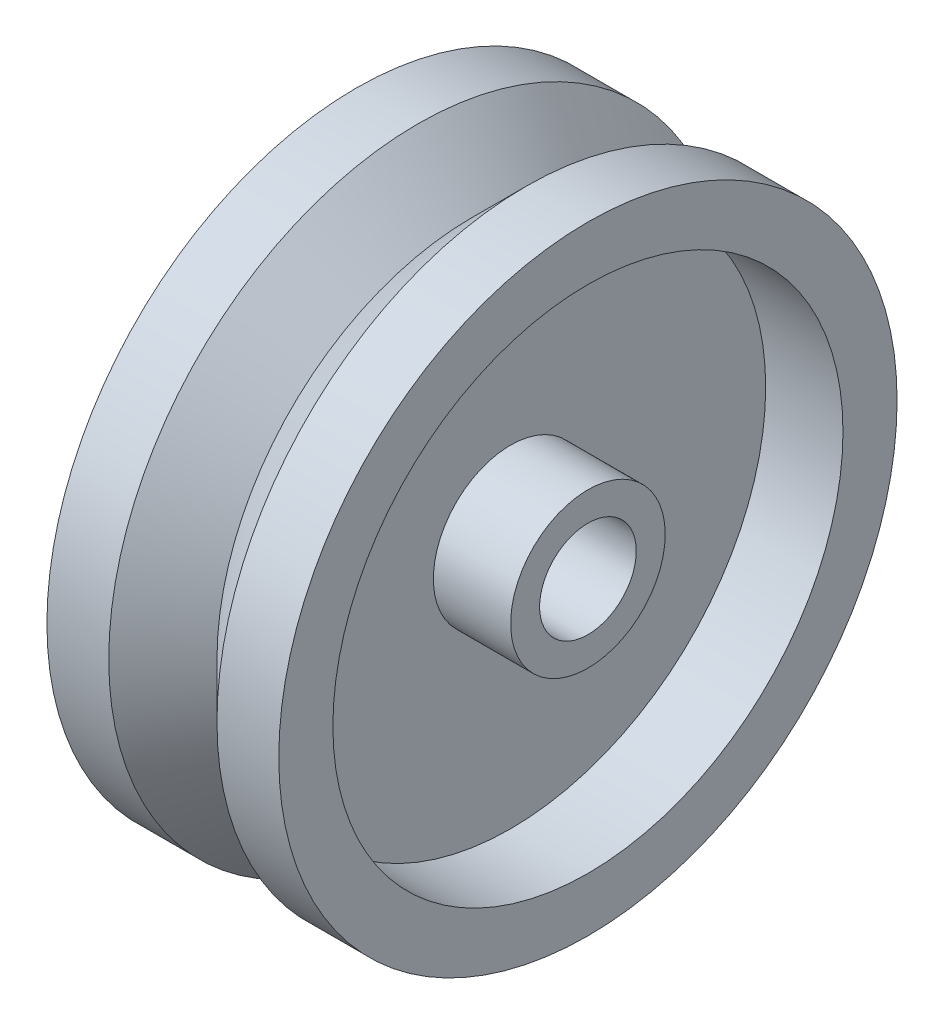
ISO-10303-21;
HEADER;
FILE_DESCRIPTION(('STEP AP214'),'2;1');
FILE_NAME('part.step','',(''),(''),'','','');
FILE_SCHEMA(('AUTOMOTIVE_DESIGN { 1 0 10303 214 1 1 1 1 }'));
ENDSEC;
DATA;
#1=APPLICATION_CONTEXT('core data for automotive mechanical design processes');
#2=APPLICATION_PROTOCOL_DEFINITION('international standard','automotive_design',2000,#1);
#3=PRODUCT_CONTEXT('',#1,'mechanical');
#4=PRODUCT('Part','Part','',(#3));
#5=PRODUCT_RELATED_PRODUCT_CATEGORY('part','',(#4));
#6=PRODUCT_DEFINITION_FORMATION('','',#4);
#7=PRODUCT_DEFINITION_CONTEXT('part definition',#1,'design');
#8=PRODUCT_DEFINITION('design','',#6,#7);
#9=PRODUCT_DEFINITION_SHAPE('','',#8);
#10=(LENGTH_UNIT() NAMED_UNIT(*) SI_UNIT(.MILLI.,.METRE.));
#11=(NAMED_UNIT(*) PLANE_ANGLE_UNIT() SI_UNIT($,.RADIAN.));
#12=(NAMED_UNIT(*) SI_UNIT($,.STERADIAN.) SOLID_ANGLE_UNIT());
#13=UNCERTAINTY_MEASURE_WITH_UNIT(LENGTH_MEASURE(1.E-05),#10,'distance_accuracy_value','');
#14=(GEOMETRIC_REPRESENTATION_CONTEXT(3) GLOBAL_UNCERTAINTY_ASSIGNED_CONTEXT((#13)) GLOBAL_UNIT_ASSIGNED_CONTEXT((#10,
#11,#12)) REPRESENTATION_CONTEXT('',''));
#15=CARTESIAN_POINT('',(0.,0.,0.));
#16=DIRECTION('',(0.,0.,1.));
#17=DIRECTION('',(1.,0.,0.));
#18=AXIS2_PLACEMENT_3D('',#15,#16,#17);
#19=CARTESIAN_POINT('',(7.5,0.,0.));
#20=DIRECTION('',(-1.,0.,0.));
#21=DIRECTION('',(0.,0.,1.));
#22=AXIS2_PLACEMENT_3D('',#19,#20,#21);
#23=CYLINDRICAL_SURFACE('',#22,20.);
#24=CARTESIAN_POINT('',(-7.5,0.,0.));
#25=DIRECTION('',(1.,0.,0.));
#26=DIRECTION('',(0.,0.,-1.));
#27=AXIS2_PLACEMENT_3D('',#24,#25,#26);
#28=CIRCLE('',#27,20.);
#29=CARTESIAN_POINT('',(-7.5,0.,-20.));
#30=VERTEX_POINT('',#29);
#31=EDGE_CURVE('E45',#30,#30,#28,.T.);
#32=ORIENTED_EDGE('',*,*,#31,.T.);
#33=EDGE_LOOP('',(#32));
#34=FACE_BOUND('',#33,.T.);
#35=CARTESIAN_POINT('',(-3.5,0.,0.));
#36=DIRECTION('',(-1.,0.,0.));
#37=DIRECTION('',(0.,0.,1.));
#38=AXIS2_PLACEMENT_3D('',#35,#36,#37);
#39=CIRCLE('',#38,20.);
#40=CARTESIAN_POINT('',(-3.5,0.,20.));
#41=VERTEX_POINT('',#40);
#42=EDGE_CURVE('E88',#41,#41,#39,.T.);
#43=ORIENTED_EDGE('',*,*,#42,.T.);
#44=EDGE_LOOP('',(#43));
#45=FACE_BOUND('',#44,.T.);
#46=ADVANCED_FACE('F39',(#34,#45),#23,.T.);
#47=CARTESIAN_POINT('',(7.5,0.,0.));
#48=DIRECTION('',(1.,0.,0.));
#49=DIRECTION('',(0.,0.,-1.));
#50=AXIS2_PLACEMENT_3D('',#47,#48,#49);
#51=CIRCLE('',#50,20.);
#52=CARTESIAN_POINT('',(7.5,0.,-20.));
#53=VERTEX_POINT('',#52);
#54=EDGE_CURVE('E10',#53,#53,#51,.T.);
#55=ORIENTED_EDGE('',*,*,#54,.F.);
#56=EDGE_LOOP('',(#55));
#57=FACE_BOUND('',#56,.T.);
#58=CARTESIAN_POINT('',(3.5,0.,0.));
#59=DIRECTION('',(-1.,0.,0.));
#60=DIRECTION('',(0.,0.,1.));
#61=AXIS2_PLACEMENT_3D('',#58,#59,#60);
#62=CIRCLE('',#61,20.);
#63=CARTESIAN_POINT('',(3.5,0.,20.));
#64=VERTEX_POINT('',#63);
#65=EDGE_CURVE('E82',#64,#64,#62,.T.);
#66=ORIENTED_EDGE('',*,*,#65,.F.);
#67=EDGE_LOOP('',(#66));
#68=FACE_BOUND('',#67,.T.);
#69=ADVANCED_FACE('F107',(#57,#68),#23,.T.);
#70=CARTESIAN_POINT('',(-7.5,0.,0.));
#71=DIRECTION('',(1.,0.,0.));
#72=DIRECTION('',(0.,0.,-1.));
#73=AXIS2_PLACEMENT_3D('',#70,#71,#72);
#74=PLANE('',#73);
#75=CARTESIAN_POINT('',(-7.5,0.,0.));
#76=DIRECTION('',(1.,0.,0.));
#77=DIRECTION('',(0.,0.,-1.));
#78=AXIS2_PLACEMENT_3D('',#75,#76,#77);
#79=CIRCLE('',#78,3.125);
#80=CARTESIAN_POINT('',(-7.5,0.,-3.125));
#81=VERTEX_POINT('',#80);
#82=EDGE_CURVE('E51',#81,#81,#79,.T.);
#83=ORIENTED_EDGE('',*,*,#82,.T.);
#84=EDGE_LOOP('',(#83));
#85=FACE_BOUND('',#84,.T.);
#86=CARTESIAN_POINT('',(-7.5,0.,0.));
#87=DIRECTION('',(1.,0.,0.));
#88=DIRECTION('',(0.,0.,-1.));
#89=AXIS2_PLACEMENT_3D('',#86,#87,#88);
#90=CIRCLE('',#89,5.);
#91=CARTESIAN_POINT('',(-7.5,0.,-5.));
#92=VERTEX_POINT('',#91);
#93=EDGE_CURVE('E73',#92,#92,#90,.T.);
#94=ORIENTED_EDGE('',*,*,#93,.F.);
#95=EDGE_LOOP('',(#94));
#96=FACE_BOUND('',#95,.T.);
#97=ADVANCED_FACE('F115',(#85,#96),#74,.F.);
#98=CARTESIAN_POINT('',(7.5,0.,0.));
#99=DIRECTION('',(1.,0.,0.));
#100=DIRECTION('',(0.,0.,-1.));
#101=AXIS2_PLACEMENT_3D('',#98,#99,#100);
#102=PLANE('',#101);
#103=CARTESIAN_POINT('',(7.5,0.,0.));
#104=DIRECTION('',(1.,0.,0.));
#105=DIRECTION('',(0.,0.,-1.));
#106=AXIS2_PLACEMENT_3D('',#103,#104,#105);
#107=CIRCLE('',#106,3.125);
#108=CARTESIAN_POINT('',(7.5,0.,-3.125));
#109=VERTEX_POINT('',#108);
#110=EDGE_CURVE('E47',#109,#109,#107,.T.);
#111=ORIENTED_EDGE('',*,*,#110,.F.);
#112=EDGE_LOOP('',(#111));
#113=FACE_BOUND('',#112,.T.);
#114=CARTESIAN_POINT('',(7.5,0.,0.));
#115=DIRECTION('',(1.,0.,0.));
#116=DIRECTION('',(0.,0.,-1.));
#117=AXIS2_PLACEMENT_3D('',#114,#115,#116);
#118=CIRCLE('',#117,5.);
#119=CARTESIAN_POINT('',(7.5,0.,-5.));
#120=VERTEX_POINT('',#119);
#121=EDGE_CURVE('E64',#120,#120,#118,.T.);
#122=ORIENTED_EDGE('',*,*,#121,.T.);
#123=EDGE_LOOP('',(#122));
#124=FACE_BOUND('',#123,.T.);
#125=ADVANCED_FACE('F128',(#113,#124),#102,.T.);
#126=CARTESIAN_POINT('',(7.5,0.,0.));
#127=DIRECTION('',(1.,0.,0.));
#128=DIRECTION('',(0.,0.,-1.));
#129=AXIS2_PLACEMENT_3D('',#126,#127,#128);
#130=CIRCLE('',#129,16.5);
#131=CARTESIAN_POINT('',(7.5,0.,-16.5));
#132=VERTEX_POINT('',#131);
#133=EDGE_CURVE('E60',#132,#132,#130,.T.);
#134=ORIENTED_EDGE('',*,*,#133,.F.);
#135=EDGE_LOOP('',(#134));
#136=FACE_BOUND('',#135,.T.);
#137=ORIENTED_EDGE('',*,*,#54,.T.);
#138=EDGE_LOOP('',(#137));
#139=FACE_BOUND('',#138,.T.);
#140=ADVANCED_FACE('F116',(#136,#139),#102,.T.);
#141=CARTESIAN_POINT('',(-7.5,0.,0.));
#142=DIRECTION('',(1.,0.,0.));
#143=DIRECTION('',(0.,0.,-1.));
#144=AXIS2_PLACEMENT_3D('',#141,#142,#143);
#145=CIRCLE('',#144,16.5);
#146=CARTESIAN_POINT('',(-7.5,0.,-16.5));
#147=VERTEX_POINT('',#146);
#148=EDGE_CURVE('E68',#147,#147,#145,.T.);
#149=ORIENTED_EDGE('',*,*,#148,.T.);
#150=EDGE_LOOP('',(#149));
#151=FACE_BOUND('',#150,.T.);
#152=ORIENTED_EDGE('',*,*,#31,.F.);
#153=EDGE_LOOP('',(#152));
#154=FACE_BOUND('',#153,.T.);
#155=ADVANCED_FACE('F117',(#151,#154),#74,.F.);
#156=CARTESIAN_POINT('',(7.5,0.,0.));
#157=DIRECTION('',(-1.,0.,0.));
#158=DIRECTION('',(0.,0.,1.));
#159=AXIS2_PLACEMENT_3D('',#156,#157,#158);
#160=CYLINDRICAL_SURFACE('',#159,3.125);
#161=ORIENTED_EDGE('',*,*,#110,.T.);
#162=EDGE_LOOP('',(#161));
#163=FACE_BOUND('',#162,.T.);
#164=ORIENTED_EDGE('',*,*,#82,.F.);
#165=EDGE_LOOP('',(#164));
#166=FACE_BOUND('',#165,.T.);
#167=ADVANCED_FACE('F119',(#163,#166),#160,.F.);
#168=CARTESIAN_POINT('',(2.5,0.,0.));
#169=DIRECTION('',(1.,0.,0.));
#170=DIRECTION('',(0.,0.,-1.));
#171=AXIS2_PLACEMENT_3D('',#168,#169,#170);
#172=CYLINDRICAL_SURFACE('',#171,16.5);
#173=CARTESIAN_POINT('',(2.5,0.,0.));
#174=DIRECTION('',(1.,0.,0.));
#175=DIRECTION('',(0.,0.,-1.));
#176=AXIS2_PLACEMENT_3D('',#173,#174,#175);
#177=CIRCLE('',#176,16.5);
#178=CARTESIAN_POINT('',(2.5,0.,-16.5));
#179=VERTEX_POINT('',#178);
#180=EDGE_CURVE('E53',#179,#179,#177,.T.);
#181=ORIENTED_EDGE('',*,*,#180,.F.);
#182=EDGE_LOOP('',(#181));
#183=FACE_BOUND('',#182,.T.);
#184=ORIENTED_EDGE('',*,*,#133,.T.);
#185=EDGE_LOOP('',(#184));
#186=FACE_BOUND('',#185,.T.);
#187=ADVANCED_FACE('F127',(#183,#186),#172,.F.);
#188=CARTESIAN_POINT('',(2.5,0.,0.));
#189=DIRECTION('',(1.,0.,0.));
#190=DIRECTION('',(0.,0.,-1.));
#191=AXIS2_PLACEMENT_3D('',#188,#189,#190);
#192=PLANE('',#191);
#193=CARTESIAN_POINT('',(2.5,0.,0.));
#194=DIRECTION('',(1.,0.,0.));
#195=DIRECTION('',(0.,0.,-1.));
#196=AXIS2_PLACEMENT_3D('',#193,#194,#195);
#197=CIRCLE('',#196,5.);
#198=CARTESIAN_POINT('',(2.5,0.,-5.));
#199=VERTEX_POINT('',#198);
#200=EDGE_CURVE('E58',#199,#199,#197,.T.);
#201=ORIENTED_EDGE('',*,*,#200,.F.);
#202=EDGE_LOOP('',(#201));
#203=FACE_BOUND('',#202,.T.);
#204=ORIENTED_EDGE('',*,*,#180,.T.);
#205=EDGE_LOOP('',(#204));
#206=FACE_BOUND('',#205,.T.);
#207=ADVANCED_FACE('F151',(#203,#206),#192,.T.);
#208=CARTESIAN_POINT('',(2.5,0.,0.));
#209=DIRECTION('',(1.,0.,0.));
#210=DIRECTION('',(0.,0.,-1.));
#211=AXIS2_PLACEMENT_3D('',#208,#209,#210);
#212=CYLINDRICAL_SURFACE('',#211,5.);
#213=ORIENTED_EDGE('',*,*,#200,.T.);
#214=EDGE_LOOP('',(#213));
#215=FACE_BOUND('',#214,.T.);
#216=ORIENTED_EDGE('',*,*,#121,.F.);
#217=EDGE_LOOP('',(#216));
#218=FACE_BOUND('',#217,.T.);
#219=ADVANCED_FACE('F154',(#215,#218),#212,.T.);
#220=CARTESIAN_POINT('',(-2.5,0.,0.));
#221=DIRECTION('',(-1.,0.,0.));
#222=DIRECTION('',(0.,0.,-1.));
#223=AXIS2_PLACEMENT_3D('',#220,#221,#222);
#224=PLANE('',#223);
#225=CARTESIAN_POINT('',(-2.5,0.,0.));
#226=DIRECTION('',(1.,0.,0.));
#227=DIRECTION('',(0.,0.,-1.));
#228=AXIS2_PLACEMENT_3D('',#225,#226,#227);
#229=CIRCLE('',#228,16.5);
#230=CARTESIAN_POINT('',(-2.5,0.,-16.5));
#231=VERTEX_POINT('',#230);
#232=EDGE_CURVE('E66',#231,#231,#229,.T.);
#233=ORIENTED_EDGE('',*,*,#232,.F.);
#234=EDGE_LOOP('',(#233));
#235=FACE_BOUND('',#234,.T.);
#236=CARTESIAN_POINT('',(-2.5,0.,0.));
#237=DIRECTION('',(1.,0.,0.));
#238=DIRECTION('',(0.,0.,-1.));
#239=AXIS2_PLACEMENT_3D('',#236,#237,#238);
#240=CIRCLE('',#239,5.);
#241=CARTESIAN_POINT('',(-2.5,0.,-5.));
#242=VERTEX_POINT('',#241);
#243=EDGE_CURVE('E75',#242,#242,#240,.T.);
#244=ORIENTED_EDGE('',*,*,#243,.T.);
#245=EDGE_LOOP('',(#244));
#246=FACE_BOUND('',#245,.T.);
#247=ADVANCED_FACE('F158',(#235,#246),#224,.T.);
#248=CARTESIAN_POINT('',(-2.5,0.,0.));
#249=DIRECTION('',(-1.,0.,0.));
#250=DIRECTION('',(0.,0.,1.));
#251=AXIS2_PLACEMENT_3D('',#248,#249,#250);
#252=CYLINDRICAL_SURFACE('',#251,16.5);
#253=ORIENTED_EDGE('',*,*,#232,.T.);
#254=EDGE_LOOP('',(#253));
#255=FACE_BOUND('',#254,.T.);
#256=ORIENTED_EDGE('',*,*,#148,.F.);
#257=EDGE_LOOP('',(#256));
#258=FACE_BOUND('',#257,.T.);
#259=ADVANCED_FACE('F102',(#255,#258),#252,.F.);
#260=CARTESIAN_POINT('',(-2.5,0.,0.));
#261=DIRECTION('',(-1.,0.,0.));
#262=DIRECTION('',(0.,0.,1.));
#263=AXIS2_PLACEMENT_3D('',#260,#261,#262);
#264=CYLINDRICAL_SURFACE('',#263,5.);
#265=ORIENTED_EDGE('',*,*,#243,.F.);
#266=EDGE_LOOP('',(#265));
#267=FACE_BOUND('',#266,.T.);
#268=ORIENTED_EDGE('',*,*,#93,.T.);
#269=EDGE_LOOP('',(#268));
#270=FACE_BOUND('',#269,.T.);
#271=ADVANCED_FACE('F94',(#267,#270),#264,.T.);
#272=CARTESIAN_POINT('',(-3.5,0.,0.));
#273=DIRECTION('',(-1.,0.,0.));
#274=DIRECTION('',(0.,0.,1.));
#275=AXIS2_PLACEMENT_3D('',#272,#273,#274);
#276=CONICAL_SURFACE('',#275,20.,0.78539816339745);
#277=CARTESIAN_POINT('',(0.,0.,0.));
#278=DIRECTION('',(-1.,0.,0.));
#279=DIRECTION('',(0.,0.,1.));
#280=AXIS2_PLACEMENT_3D('',#277,#278,#279);
#281=CIRCLE('',#280,16.5);
#282=CARTESIAN_POINT('',(0.,0.,16.5));
#283=VERTEX_POINT('',#282);
#284=EDGE_CURVE('E79',#283,#283,#281,.T.);
#285=ORIENTED_EDGE('',*,*,#284,.T.);
#286=EDGE_LOOP('',(#285));
#287=FACE_BOUND('',#286,.T.);
#288=ORIENTED_EDGE('',*,*,#42,.F.);
#289=EDGE_LOOP('',(#288));
#290=FACE_BOUND('',#289,.T.);
#291=ADVANCED_FACE('F93',(#287,#290),#276,.T.);
#292=CARTESIAN_POINT('',(0.,0.,0.));
#293=DIRECTION('',(1.,0.,0.));
#294=DIRECTION('',(0.,0.,-1.));
#295=AXIS2_PLACEMENT_3D('',#292,#293,#294);
#296=CONICAL_SURFACE('',#295,16.5,0.78539816339745);
#297=ORIENTED_EDGE('',*,*,#65,.T.);
#298=EDGE_LOOP('',(#297));
#299=FACE_BOUND('',#298,.T.);
#300=ORIENTED_EDGE('',*,*,#284,.F.);
#301=EDGE_LOOP('',(#300));
#302=FACE_BOUND('',#301,.T.);
#303=ADVANCED_FACE('F91',(#299,#302),#296,.T.);
#304=CLOSED_SHELL('',(#46,#69,#97,#125,#140,#155,#167,#187,#207,#219,#247,#259,#271,#291,#303));
#305=MANIFOLD_SOLID_BREP('B2',#304);
#306=ADVANCED_BREP_SHAPE_REPRESENTATION('',(#18,#305),#14);
#307=SHAPE_DEFINITION_REPRESENTATION(#9,#306);
ENDSEC;
END-ISO-10303-21;
